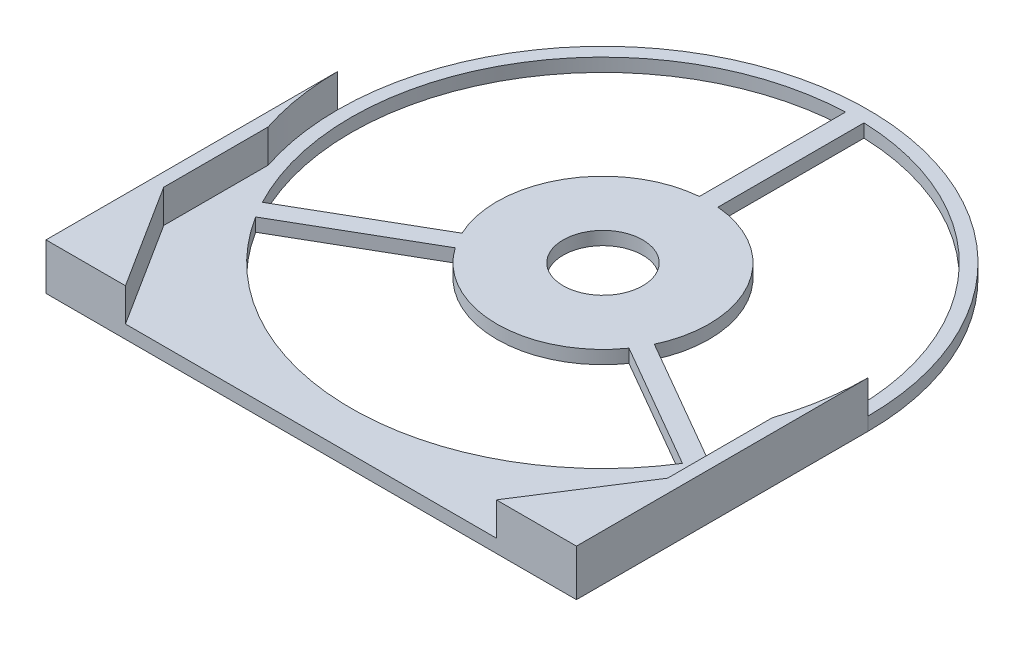
ISO-10303-21;
HEADER;
FILE_DESCRIPTION(('STEP AP214'),'2;1');
FILE_NAME('part.step','',(''),(''),'','','');
FILE_SCHEMA(('AUTOMOTIVE_DESIGN { 1 0 10303 214 1 1 1 1 }'));
ENDSEC;
DATA;
#1=APPLICATION_CONTEXT('core data for automotive mechanical design processes');
#2=APPLICATION_PROTOCOL_DEFINITION('international standard','automotive_design',2000,#1);
#3=PRODUCT_CONTEXT('',#1,'mechanical');
#4=PRODUCT('Part','Part','',(#3));
#5=PRODUCT_RELATED_PRODUCT_CATEGORY('part','',(#4));
#6=PRODUCT_DEFINITION_FORMATION('','',#4);
#7=PRODUCT_DEFINITION_CONTEXT('part definition',#1,'design');
#8=PRODUCT_DEFINITION('design','',#6,#7);
#9=PRODUCT_DEFINITION_SHAPE('','',#8);
#10=(LENGTH_UNIT() NAMED_UNIT(*) SI_UNIT(.MILLI.,.METRE.));
#11=(NAMED_UNIT(*) PLANE_ANGLE_UNIT() SI_UNIT($,.RADIAN.));
#12=(NAMED_UNIT(*) SI_UNIT($,.STERADIAN.) SOLID_ANGLE_UNIT());
#13=UNCERTAINTY_MEASURE_WITH_UNIT(LENGTH_MEASURE(1.E-05),#10,'distance_accuracy_value','');
#14=(GEOMETRIC_REPRESENTATION_CONTEXT(3) GLOBAL_UNCERTAINTY_ASSIGNED_CONTEXT((#13)) GLOBAL_UNIT_ASSIGNED_CONTEXT((#10,
#11,#12)) REPRESENTATION_CONTEXT('',''));
#15=CARTESIAN_POINT('',(0.,0.,0.));
#16=DIRECTION('',(0.,0.,1.));
#17=DIRECTION('',(1.,0.,0.));
#18=AXIS2_PLACEMENT_3D('',#15,#16,#17);
#19=CARTESIAN_POINT('',(0.,1.,0.));
#20=DIRECTION('',(0.,1.,0.));
#21=DIRECTION('',(0.,0.,1.));
#22=AXIS2_PLACEMENT_3D('',#19,#20,#21);
#23=PLANE('',#22);
#24=DIRECTION('',(-0.866025403784443,0.,0.499999999999992));
#25=VECTOR('',#24,1.);
#26=CARTESIAN_POINT('',(-0.349999999999994,1.,-0.60621778264911));
#27=LINE('',#26,#25);
#28=CARTESIAN_POINT('',(-7.25163024219643,1.,3.37844029553018));
#29=VERTEX_POINT('',#28);
#30=CARTESIAN_POINT('',(-16.7933117102366,1.,8.88733265962469));
#31=VERTEX_POINT('',#30);
#32=EDGE_CURVE('E373',#29,#31,#27,.T.);
#33=ORIENTED_EDGE('',*,*,#32,.T.);
#34=CARTESIAN_POINT('',(0.,1.,0.));
#35=DIRECTION('',(0.,1.,0.));
#36=DIRECTION('',(0.,0.,1.));
#37=AXIS2_PLACEMENT_3D('',#34,#35,#36);
#38=CIRCLE('',#37,19.);
#39=CARTESIAN_POINT('',(-0.700000000000007,1.,-18.9871008845479));
#40=VERTEX_POINT('',#39);
#41=EDGE_CURVE('E371',#40,#31,#38,.T.);
#42=ORIENTED_EDGE('',*,*,#41,.F.);
#43=DIRECTION('',(0.,0.,-1.));
#44=VECTOR('',#43,1.);
#45=CARTESIAN_POINT('',(-0.7,1.,0.));
#46=LINE('',#45,#44);
#47=CARTESIAN_POINT('',(-0.700000000000003,1.,-7.96931615635871));
#48=VERTEX_POINT('',#47);
#49=EDGE_CURVE('E349',#48,#40,#46,.T.);
#50=ORIENTED_EDGE('',*,*,#49,.F.);
#51=CARTESIAN_POINT('',(0.,1.,0.));
#52=DIRECTION('',(0.,1.,0.));
#53=DIRECTION('',(0.,0.,1.));
#54=AXIS2_PLACEMENT_3D('',#51,#52,#53);
#55=CIRCLE('',#54,8.);
#56=EDGE_CURVE('E361',#48,#29,#55,.T.);
#57=ORIENTED_EDGE('',*,*,#56,.T.);
#58=EDGE_LOOP('',(#33,#42,#50,#57));
#59=FACE_BOUND('',#58,.T.);
#60=DIRECTION('',(0.,0.,-1.));
#61=VECTOR('',#60,1.);
#62=CARTESIAN_POINT('',(0.7,1.,0.));
#63=LINE('',#62,#61);
#64=CARTESIAN_POINT('',(0.7,1.,-7.96931615635871));
#65=VERTEX_POINT('',#64);
#66=CARTESIAN_POINT('',(0.7,1.,-18.9871008845479));
#67=VERTEX_POINT('',#66);
#68=EDGE_CURVE('E342',#65,#67,#63,.T.);
#69=ORIENTED_EDGE('',*,*,#68,.T.);
#70=CARTESIAN_POINT('',(0.,1.,0.));
#71=DIRECTION('',(0.,1.,0.));
#72=DIRECTION('',(0.,0.,1.));
#73=AXIS2_PLACEMENT_3D('',#70,#71,#72);
#74=CIRCLE('',#73,19.);
#75=CARTESIAN_POINT('',(16.7933117102364,1.,8.88733265962492));
#76=VERTEX_POINT('',#75);
#77=EDGE_CURVE('E340',#76,#67,#74,.T.);
#78=ORIENTED_EDGE('',*,*,#77,.F.);
#79=DIRECTION('',(0.866025403784437,0.,0.500000000000004));
#80=VECTOR('',#79,1.);
#81=CARTESIAN_POINT('',(0.350000000000003,1.,-0.606217782649106));
#82=LINE('',#81,#80);
#83=CARTESIAN_POINT('',(7.25163024219639,1.,3.37844029553028));
#84=VERTEX_POINT('',#83);
#85=EDGE_CURVE('E319',#84,#76,#82,.T.);
#86=ORIENTED_EDGE('',*,*,#85,.F.);
#87=CARTESIAN_POINT('',(0.,1.,0.));
#88=DIRECTION('',(0.,1.,0.));
#89=DIRECTION('',(0.,0.,1.));
#90=AXIS2_PLACEMENT_3D('',#87,#88,#89);
#91=CIRCLE('',#90,8.);
#92=EDGE_CURVE('E330',#84,#65,#91,.T.);
#93=ORIENTED_EDGE('',*,*,#92,.T.);
#94=EDGE_LOOP('',(#69,#78,#86,#93));
#95=FACE_BOUND('',#94,.T.);
#96=CARTESIAN_POINT('',(0.,1.,0.));
#97=DIRECTION('',(0.,1.,0.));
#98=DIRECTION('',(0.,0.,1.));
#99=AXIS2_PLACEMENT_3D('',#96,#97,#98);
#100=CIRCLE('',#99,3.);
#101=CARTESIAN_POINT('',(0.,1.,3.));
#102=VERTEX_POINT('',#101);
#103=EDGE_CURVE('E288',#102,#102,#100,.T.);
#104=ORIENTED_EDGE('',*,*,#103,.F.);
#105=EDGE_LOOP('',(#104));
#106=FACE_BOUND('',#105,.T.);
#107=DIRECTION('',(-0.866025403784443,0.,0.499999999999992));
#108=VECTOR('',#107,1.);
#109=CARTESIAN_POINT('',(0.349999999999995,1.,0.60621778264911));
#110=LINE('',#109,#108);
#111=CARTESIAN_POINT('',(-6.55163024219645,1.,4.59087586082841));
#112=VERTEX_POINT('',#111);
#113=CARTESIAN_POINT('',(-16.0933117102366,1.,10.0997682249229));
#114=VERTEX_POINT('',#113);
#115=EDGE_CURVE('E292',#112,#114,#110,.T.);
#116=ORIENTED_EDGE('',*,*,#115,.F.);
#117=CARTESIAN_POINT('',(0.,1.,0.));
#118=DIRECTION('',(0.,1.,0.));
#119=DIRECTION('',(0.,0.,1.));
#120=AXIS2_PLACEMENT_3D('',#117,#118,#119);
#121=CIRCLE('',#120,8.);
#122=CARTESIAN_POINT('',(6.55163024219638,1.,4.59087586082849));
#123=VERTEX_POINT('',#122);
#124=EDGE_CURVE('E299',#112,#123,#121,.T.);
#125=ORIENTED_EDGE('',*,*,#124,.T.);
#126=DIRECTION('',(0.866025403784436,0.,0.500000000000004));
#127=VECTOR('',#126,1.);
#128=CARTESIAN_POINT('',(-0.350000000000003,1.,0.606217782649106));
#129=LINE('',#128,#127);
#130=CARTESIAN_POINT('',(16.0933117102364,1.,10.0997682249231));
#131=VERTEX_POINT('',#130);
#132=EDGE_CURVE('E312',#123,#131,#129,.T.);
#133=ORIENTED_EDGE('',*,*,#132,.T.);
#134=CARTESIAN_POINT('',(0.,1.,0.));
#135=DIRECTION('',(0.,1.,0.));
#136=DIRECTION('',(0.,0.,1.));
#137=AXIS2_PLACEMENT_3D('',#134,#135,#136);
#138=CIRCLE('',#137,19.);
#139=EDGE_CURVE('E309',#114,#131,#138,.T.);
#140=ORIENTED_EDGE('',*,*,#139,.F.);
#141=EDGE_LOOP('',(#116,#125,#133,#140));
#142=FACE_BOUND('',#141,.T.);
#143=DIRECTION('',(0.,0.,1.));
#144=VECTOR('',#143,1.);
#145=CARTESIAN_POINT('',(-19.,1.,-20.));
#146=LINE('',#145,#144);
#147=CARTESIAN_POINT('',(-19.,1.,6.24499799839841));
#148=VERTEX_POINT('',#147);
#149=CARTESIAN_POINT('',(-19.,1.,14.1224989991992));
#150=VERTEX_POINT('',#149);
#151=EDGE_CURVE('E279',#148,#150,#146,.T.);
#152=ORIENTED_EDGE('',*,*,#151,.T.);
#153=DIRECTION('',(-0.53529760919979,0.,-0.844663524478824));
#154=VECTOR('',#153,1.);
#155=CARTESIAN_POINT('',(-19.,1.,14.1224989991992));
#156=LINE('',#155,#154);
#157=CARTESIAN_POINT('',(-14.0077074124877,1.,22.));
#158=VERTEX_POINT('',#157);
#159=EDGE_CURVE('E101',#158,#150,#156,.T.);
#160=ORIENTED_EDGE('',*,*,#159,.F.);
#161=DIRECTION('',(1.,0.,0.));
#162=VECTOR('',#161,1.);
#163=CARTESIAN_POINT('',(-19.,1.,22.));
#164=LINE('',#163,#162);
#165=CARTESIAN_POINT('',(13.9609349112244,1.,22.));
#166=VERTEX_POINT('',#165);
#167=EDGE_CURVE('E259',#158,#166,#164,.T.);
#168=ORIENTED_EDGE('',*,*,#167,.T.);
#169=DIRECTION('',(-0.538861327297642,0.,0.842394485940538));
#170=VECTOR('',#169,1.);
#171=CARTESIAN_POINT('',(19.,1.,14.1224989991992));
#172=LINE('',#171,#170);
#173=CARTESIAN_POINT('',(19.,1.,14.1224989991992));
#174=VERTEX_POINT('',#173);
#175=EDGE_CURVE('E261',#174,#166,#172,.T.);
#176=ORIENTED_EDGE('',*,*,#175,.F.);
#177=DIRECTION('',(0.,0.,1.));
#178=VECTOR('',#177,1.);
#179=CARTESIAN_POINT('',(19.,1.,-20.));
#180=LINE('',#179,#178);
#181=CARTESIAN_POINT('',(19.,1.,6.24499799839841));
#182=VERTEX_POINT('',#181);
#183=EDGE_CURVE('E280',#182,#174,#180,.T.);
#184=ORIENTED_EDGE('',*,*,#183,.F.);
#185=CARTESIAN_POINT('',(0.,1.,0.));
#186=DIRECTION('',(0.,1.,0.));
#187=DIRECTION('',(0.,0.,1.));
#188=AXIS2_PLACEMENT_3D('',#185,#186,#187);
#189=CIRCLE('',#188,20.);
#190=CARTESIAN_POINT('',(20.,1.,0.));
#191=VERTEX_POINT('',#190);
#192=EDGE_CURVE('E380',#182,#191,#189,.T.);
#193=ORIENTED_EDGE('',*,*,#192,.T.);
#194=CARTESIAN_POINT('',(0.,1.,0.));
#195=DIRECTION('',(0.,1.,0.));
#196=DIRECTION('',(0.,0.,1.));
#197=AXIS2_PLACEMENT_3D('',#194,#195,#196);
#198=CIRCLE('',#197,20.);
#199=CARTESIAN_POINT('',(-20.,1.,0.));
#200=VERTEX_POINT('',#199);
#201=EDGE_CURVE('E405',#191,#200,#198,.T.);
#202=ORIENTED_EDGE('',*,*,#201,.T.);
#203=EDGE_CURVE('E396',#200,#148,#189,.T.);
#204=ORIENTED_EDGE('',*,*,#203,.T.);
#205=EDGE_LOOP('',(#152,#160,#168,#176,#184,#193,#202,#204));
#206=FACE_BOUND('',#205,.T.);
#207=ADVANCED_FACE('F86',(#59,#95,#106,#142,#206),#23,.T.);
#208=CARTESIAN_POINT('',(-19.,3.5,-20.));
#209=DIRECTION('',(-1.,0.,0.));
#210=DIRECTION('',(0.,0.,1.));
#211=AXIS2_PLACEMENT_3D('',#208,#209,#210);
#212=PLANE('',#211);
#213=DIRECTION('',(0.,-1.,0.));
#214=VECTOR('',#213,1.);
#215=CARTESIAN_POINT('',(-19.,3.5,14.1224989991992));
#216=LINE('',#215,#214);
#217=CARTESIAN_POINT('',(-19.,3.5,14.1224989991992));
#218=VERTEX_POINT('',#217);
#219=EDGE_CURVE('E108',#218,#150,#216,.T.);
#220=ORIENTED_EDGE('',*,*,#219,.T.);
#221=ORIENTED_EDGE('',*,*,#151,.F.);
#222=DIRECTION('',(0.,-1.,0.));
#223=VECTOR('',#222,1.);
#224=CARTESIAN_POINT('',(-19.,3.5,6.24499799839841));
#225=LINE('',#224,#223);
#226=CARTESIAN_POINT('',(-19.,3.5,6.24499799839841));
#227=VERTEX_POINT('',#226);
#228=EDGE_CURVE('E286',#148,#227,#225,.F.);
#229=ORIENTED_EDGE('',*,*,#228,.T.);
#230=DIRECTION('',(0.,0.,1.));
#231=VECTOR('',#230,1.);
#232=CARTESIAN_POINT('',(-19.,3.5,0.));
#233=LINE('',#232,#231);
#234=EDGE_CURVE('E12',#227,#218,#233,.T.);
#235=ORIENTED_EDGE('',*,*,#234,.T.);
#236=EDGE_LOOP('',(#220,#221,#229,#235));
#237=FACE_BOUND('',#236,.T.);
#238=ADVANCED_FACE('F454',(#237),#212,.F.);
#239=CARTESIAN_POINT('',(19.,3.5,-20.));
#240=DIRECTION('',(1.,0.,0.));
#241=DIRECTION('',(0.,0.,-1.));
#242=AXIS2_PLACEMENT_3D('',#239,#240,#241);
#243=PLANE('',#242);
#244=DIRECTION('',(0.,-1.,0.));
#245=VECTOR('',#244,1.);
#246=CARTESIAN_POINT('',(19.,3.5,14.1224989991992));
#247=LINE('',#246,#245);
#248=CARTESIAN_POINT('',(19.,3.5,14.1224989991992));
#249=VERTEX_POINT('',#248);
#250=EDGE_CURVE('E275',#249,#174,#247,.T.);
#251=ORIENTED_EDGE('',*,*,#250,.F.);
#252=DIRECTION('',(0.,0.,-1.));
#253=VECTOR('',#252,1.);
#254=CARTESIAN_POINT('',(19.,3.5,0.));
#255=LINE('',#254,#253);
#256=CARTESIAN_POINT('',(19.,3.5,6.24499799839841));
#257=VERTEX_POINT('',#256);
#258=EDGE_CURVE('E94',#249,#257,#255,.T.);
#259=ORIENTED_EDGE('',*,*,#258,.T.);
#260=DIRECTION('',(0.,-1.,0.));
#261=VECTOR('',#260,1.);
#262=CARTESIAN_POINT('',(19.,3.5,6.24499799839841));
#263=LINE('',#262,#261);
#264=EDGE_CURVE('E283',#257,#182,#263,.T.);
#265=ORIENTED_EDGE('',*,*,#264,.T.);
#266=ORIENTED_EDGE('',*,*,#183,.T.);
#267=EDGE_LOOP('',(#251,#259,#265,#266));
#268=FACE_BOUND('',#267,.T.);
#269=ADVANCED_FACE('F427',(#268),#243,.F.);
#270=CARTESIAN_POINT('',(0.,3.5,0.));
#271=DIRECTION('',(0.,-1.,0.));
#272=DIRECTION('',(0.,0.,-1.));
#273=AXIS2_PLACEMENT_3D('',#270,#271,#272);
#274=CYLINDRICAL_SURFACE('',#273,20.);
#275=ORIENTED_EDGE('',*,*,#228,.F.);
#276=ORIENTED_EDGE('',*,*,#203,.F.);
#277=DIRECTION('',(0.,-1.,0.));
#278=VECTOR('',#277,1.);
#279=CARTESIAN_POINT('',(-20.,3.5,0.));
#280=LINE('',#279,#278);
#281=CARTESIAN_POINT('',(-20.,3.5,0.));
#282=VERTEX_POINT('',#281);
#283=EDGE_CURVE('E401',#282,#200,#280,.T.);
#284=ORIENTED_EDGE('',*,*,#283,.F.);
#285=CARTESIAN_POINT('',(0.,3.5,0.));
#286=DIRECTION('',(0.,1.,0.));
#287=DIRECTION('',(0.,0.,1.));
#288=AXIS2_PLACEMENT_3D('',#285,#286,#287);
#289=CIRCLE('',#288,20.);
#290=EDGE_CURVE('E388',#282,#227,#289,.T.);
#291=ORIENTED_EDGE('',*,*,#290,.T.);
#292=EDGE_LOOP('',(#275,#276,#284,#291));
#293=FACE_BOUND('',#292,.T.);
#294=ADVANCED_FACE('F453',(#293),#274,.F.);
#295=CARTESIAN_POINT('',(0.,3.5,0.));
#296=DIRECTION('',(0.,1.,0.));
#297=DIRECTION('',(0.,0.,1.));
#298=AXIS2_PLACEMENT_3D('',#295,#296,#297);
#299=PLANE('',#298);
#300=ORIENTED_EDGE('',*,*,#234,.F.);
#301=ORIENTED_EDGE('',*,*,#290,.F.);
#302=DIRECTION('',(0.,0.,1.));
#303=VECTOR('',#302,1.);
#304=CARTESIAN_POINT('',(-20.,3.5,0.));
#305=LINE('',#304,#303);
#306=CARTESIAN_POINT('',(-20.,3.5,22.));
#307=VERTEX_POINT('',#306);
#308=EDGE_CURVE('E249',#282,#307,#305,.T.);
#309=ORIENTED_EDGE('',*,*,#308,.T.);
#310=DIRECTION('',(1.,0.,0.));
#311=VECTOR('',#310,1.);
#312=CARTESIAN_POINT('',(0.,3.5,22.));
#313=LINE('',#312,#311);
#314=CARTESIAN_POINT('',(-14.0077074124877,3.5,22.));
#315=VERTEX_POINT('',#314);
#316=EDGE_CURVE('E241',#307,#315,#313,.T.);
#317=ORIENTED_EDGE('',*,*,#316,.T.);
#318=DIRECTION('',(-0.53529760919979,0.,-0.844663524478824));
#319=VECTOR('',#318,1.);
#320=CARTESIAN_POINT('',(-19.,3.5,14.1224989991992));
#321=LINE('',#320,#319);
#322=EDGE_CURVE('E246',#315,#218,#321,.T.);
#323=ORIENTED_EDGE('',*,*,#322,.T.);
#324=EDGE_LOOP('',(#300,#301,#309,#317,#323));
#325=FACE_BOUND('',#324,.T.);
#326=ADVANCED_FACE('F244',(#325),#299,.T.);
#327=CARTESIAN_POINT('',(20.,1.,0.));
#328=DIRECTION('',(1.,0.,0.));
#329=DIRECTION('',(0.,0.,-1.));
#330=AXIS2_PLACEMENT_3D('',#327,#328,#329);
#331=PLANE('',#330);
#332=DIRECTION('',(0.,0.,1.));
#333=VECTOR('',#332,1.);
#334=CARTESIAN_POINT('',(20.,0.,0.));
#335=LINE('',#334,#333);
#336=CARTESIAN_POINT('',(20.,0.,0.));
#337=VERTEX_POINT('',#336);
#338=CARTESIAN_POINT('',(20.,0.,22.));
#339=VERTEX_POINT('',#338);
#340=EDGE_CURVE('E404',#337,#339,#335,.T.);
#341=ORIENTED_EDGE('',*,*,#340,.F.);
#342=DIRECTION('',(0.,-1.,0.));
#343=VECTOR('',#342,1.);
#344=CARTESIAN_POINT('',(20.,1.,0.));
#345=LINE('',#344,#343);
#346=EDGE_CURVE('E423',#191,#337,#345,.T.);
#347=ORIENTED_EDGE('',*,*,#346,.F.);
#348=DIRECTION('',(0.,-1.,0.));
#349=VECTOR('',#348,1.);
#350=CARTESIAN_POINT('',(20.,3.5,0.));
#351=LINE('',#350,#349);
#352=CARTESIAN_POINT('',(20.,3.5,0.));
#353=VERTEX_POINT('',#352);
#354=EDGE_CURVE('E395',#353,#191,#351,.T.);
#355=ORIENTED_EDGE('',*,*,#354,.F.);
#356=DIRECTION('',(0.,0.,-1.));
#357=VECTOR('',#356,1.);
#358=CARTESIAN_POINT('',(20.,3.5,0.));
#359=LINE('',#358,#357);
#360=CARTESIAN_POINT('',(20.,3.5,22.));
#361=VERTEX_POINT('',#360);
#362=EDGE_CURVE('E252',#361,#353,#359,.T.);
#363=ORIENTED_EDGE('',*,*,#362,.F.);
#364=DIRECTION('',(0.,-1.,0.));
#365=VECTOR('',#364,1.);
#366=CARTESIAN_POINT('',(20.,1.,22.));
#367=LINE('',#366,#365);
#368=EDGE_CURVE('E407',#361,#339,#367,.T.);
#369=ORIENTED_EDGE('',*,*,#368,.T.);
#370=EDGE_LOOP('',(#341,#347,#355,#363,#369));
#371=FACE_BOUND('',#370,.T.);
#372=ADVANCED_FACE('F88',(#371),#331,.T.);
#373=CARTESIAN_POINT('',(0.,1.,0.));
#374=DIRECTION('',(0.,-1.,0.));
#375=DIRECTION('',(0.,0.,-1.));
#376=AXIS2_PLACEMENT_3D('',#373,#374,#375);
#377=CYLINDRICAL_SURFACE('',#376,20.);
#378=CARTESIAN_POINT('',(0.,0.,0.));
#379=DIRECTION('',(0.,1.,0.));
#380=DIRECTION('',(0.,0.,1.));
#381=AXIS2_PLACEMENT_3D('',#378,#379,#380);
#382=CIRCLE('',#381,20.);
#383=CARTESIAN_POINT('',(-20.,0.,0.));
#384=VERTEX_POINT('',#383);
#385=EDGE_CURVE('E411',#337,#384,#382,.T.);
#386=ORIENTED_EDGE('',*,*,#385,.T.);
#387=DIRECTION('',(0.,-1.,0.));
#388=VECTOR('',#387,1.);
#389=CARTESIAN_POINT('',(-20.,1.,0.));
#390=LINE('',#389,#388);
#391=EDGE_CURVE('E420',#200,#384,#390,.T.);
#392=ORIENTED_EDGE('',*,*,#391,.F.);
#393=ORIENTED_EDGE('',*,*,#201,.F.);
#394=ORIENTED_EDGE('',*,*,#346,.T.);
#395=EDGE_LOOP('',(#386,#392,#393,#394));
#396=FACE_BOUND('',#395,.T.);
#397=ADVANCED_FACE('F446',(#396),#377,.T.);
#398=CARTESIAN_POINT('',(-20.,1.,0.));
#399=DIRECTION('',(1.,0.,0.));
#400=DIRECTION('',(0.,0.,-1.));
#401=AXIS2_PLACEMENT_3D('',#398,#399,#400);
#402=PLANE('',#401);
#403=DIRECTION('',(0.,0.,1.));
#404=VECTOR('',#403,1.);
#405=CARTESIAN_POINT('',(-20.,0.,0.));
#406=LINE('',#405,#404);
#407=CARTESIAN_POINT('',(-20.,0.,22.));
#408=VERTEX_POINT('',#407);
#409=EDGE_CURVE('E413',#384,#408,#406,.T.);
#410=ORIENTED_EDGE('',*,*,#409,.T.);
#411=DIRECTION('',(0.,-1.,0.));
#412=VECTOR('',#411,1.);
#413=CARTESIAN_POINT('',(-20.,1.,22.));
#414=LINE('',#413,#412);
#415=EDGE_CURVE('E418',#307,#408,#414,.T.);
#416=ORIENTED_EDGE('',*,*,#415,.F.);
#417=ORIENTED_EDGE('',*,*,#308,.F.);
#418=ORIENTED_EDGE('',*,*,#283,.T.);
#419=ORIENTED_EDGE('',*,*,#391,.T.);
#420=EDGE_LOOP('',(#410,#416,#417,#418,#419));
#421=FACE_BOUND('',#420,.T.);
#422=ADVANCED_FACE('F449',(#421),#402,.F.);
#423=CARTESIAN_POINT('',(0.,1.,22.));
#424=DIRECTION('',(0.,0.,-1.));
#425=DIRECTION('',(-1.,0.,0.));
#426=AXIS2_PLACEMENT_3D('',#423,#424,#425);
#427=PLANE('',#426);
#428=ORIENTED_EDGE('',*,*,#167,.F.);
#429=DIRECTION('',(0.,-1.,0.));
#430=VECTOR('',#429,1.);
#431=CARTESIAN_POINT('',(-14.0077074124877,3.5,22.));
#432=LINE('',#431,#430);
#433=EDGE_CURVE('E256',#315,#158,#432,.T.);
#434=ORIENTED_EDGE('',*,*,#433,.F.);
#435=ORIENTED_EDGE('',*,*,#316,.F.);
#436=ORIENTED_EDGE('',*,*,#415,.T.);
#437=DIRECTION('',(1.,0.,0.));
#438=VECTOR('',#437,1.);
#439=CARTESIAN_POINT('',(0.,0.,22.));
#440=LINE('',#439,#438);
#441=EDGE_CURVE('E408',#408,#339,#440,.T.);
#442=ORIENTED_EDGE('',*,*,#441,.T.);
#443=ORIENTED_EDGE('',*,*,#368,.F.);
#444=CARTESIAN_POINT('',(13.9609349112244,3.5,22.));
#445=VERTEX_POINT('',#444);
#446=EDGE_CURVE('E253',#445,#361,#313,.T.);
#447=ORIENTED_EDGE('',*,*,#446,.F.);
#448=DIRECTION('',(0.,-1.,0.));
#449=VECTOR('',#448,1.);
#450=CARTESIAN_POINT('',(13.9609349112244,3.5,22.));
#451=LINE('',#450,#449);
#452=EDGE_CURVE('E271',#445,#166,#451,.T.);
#453=ORIENTED_EDGE('',*,*,#452,.T.);
#454=EDGE_LOOP('',(#428,#434,#435,#436,#442,#443,#447,#453));
#455=FACE_BOUND('',#454,.T.);
#456=ADVANCED_FACE('F257',(#455),#427,.F.);
#457=CARTESIAN_POINT('',(0.,0.,0.));
#458=DIRECTION('',(0.,1.,0.));
#459=DIRECTION('',(0.,0.,1.));
#460=AXIS2_PLACEMENT_3D('',#457,#458,#459);
#461=PLANE('',#460);
#462=CARTESIAN_POINT('',(0.,0.,0.));
#463=DIRECTION('',(0.,1.,0.));
#464=DIRECTION('',(0.,0.,1.));
#465=AXIS2_PLACEMENT_3D('',#462,#463,#464);
#466=CIRCLE('',#465,3.);
#467=CARTESIAN_POINT('',(0.,0.,3.));
#468=VERTEX_POINT('',#467);
#469=EDGE_CURVE('E289',#468,#468,#466,.T.);
#470=ORIENTED_EDGE('',*,*,#469,.T.);
#471=EDGE_LOOP('',(#470));
#472=FACE_BOUND('',#471,.T.);
#473=CARTESIAN_POINT('',(0.,0.,0.));
#474=DIRECTION('',(0.,1.,0.));
#475=DIRECTION('',(0.,0.,1.));
#476=AXIS2_PLACEMENT_3D('',#473,#474,#475);
#477=CIRCLE('',#476,8.);
#478=CARTESIAN_POINT('',(-6.55163024219645,0.,4.59087586082841));
#479=VERTEX_POINT('',#478);
#480=CARTESIAN_POINT('',(6.55163024219638,0.,4.59087586082849));
#481=VERTEX_POINT('',#480);
#482=EDGE_CURVE('E305',#479,#481,#477,.T.);
#483=ORIENTED_EDGE('',*,*,#482,.F.);
#484=DIRECTION('',(-0.866025403784443,0.,0.499999999999992));
#485=VECTOR('',#484,1.);
#486=CARTESIAN_POINT('',(0.349999999999995,0.,0.60621778264911));
#487=LINE('',#486,#485);
#488=CARTESIAN_POINT('',(-16.0933117102366,0.,10.0997682249229));
#489=VERTEX_POINT('',#488);
#490=EDGE_CURVE('E295',#479,#489,#487,.T.);
#491=ORIENTED_EDGE('',*,*,#490,.T.);
#492=CARTESIAN_POINT('',(0.,0.,0.));
#493=DIRECTION('',(0.,1.,0.));
#494=DIRECTION('',(0.,0.,1.));
#495=AXIS2_PLACEMENT_3D('',#492,#493,#494);
#496=CIRCLE('',#495,19.);
#497=CARTESIAN_POINT('',(16.0933117102364,0.,10.0997682249231));
#498=VERTEX_POINT('',#497);
#499=EDGE_CURVE('E298',#489,#498,#496,.T.);
#500=ORIENTED_EDGE('',*,*,#499,.T.);
#501=DIRECTION('',(0.866025403784436,0.,0.500000000000004));
#502=VECTOR('',#501,1.);
#503=CARTESIAN_POINT('',(-0.350000000000003,0.,0.606217782649106));
#504=LINE('',#503,#502);
#505=EDGE_CURVE('E302',#481,#498,#504,.T.);
#506=ORIENTED_EDGE('',*,*,#505,.F.);
#507=EDGE_LOOP('',(#483,#491,#500,#506));
#508=FACE_BOUND('',#507,.T.);
#509=CARTESIAN_POINT('',(0.,0.,0.));
#510=DIRECTION('',(0.,1.,0.));
#511=DIRECTION('',(0.,0.,1.));
#512=AXIS2_PLACEMENT_3D('',#509,#510,#511);
#513=CIRCLE('',#512,8.);
#514=CARTESIAN_POINT('',(7.25163024219639,0.,3.37844029553028));
#515=VERTEX_POINT('',#514);
#516=CARTESIAN_POINT('',(0.7,0.,-7.96931615635871));
#517=VERTEX_POINT('',#516);
#518=EDGE_CURVE('E336',#515,#517,#513,.T.);
#519=ORIENTED_EDGE('',*,*,#518,.F.);
#520=DIRECTION('',(0.866025403784437,0.,0.500000000000004));
#521=VECTOR('',#520,1.);
#522=CARTESIAN_POINT('',(0.350000000000003,0.,-0.606217782649106));
#523=LINE('',#522,#521);
#524=CARTESIAN_POINT('',(16.7933117102364,0.,8.88733265962492));
#525=VERTEX_POINT('',#524);
#526=EDGE_CURVE('E326',#515,#525,#523,.T.);
#527=ORIENTED_EDGE('',*,*,#526,.T.);
#528=CARTESIAN_POINT('',(0.,0.,0.));
#529=DIRECTION('',(0.,1.,0.));
#530=DIRECTION('',(0.,0.,1.));
#531=AXIS2_PLACEMENT_3D('',#528,#529,#530);
#532=CIRCLE('',#531,19.);
#533=CARTESIAN_POINT('',(0.7,0.,-18.9871008845479));
#534=VERTEX_POINT('',#533);
#535=EDGE_CURVE('E329',#525,#534,#532,.T.);
#536=ORIENTED_EDGE('',*,*,#535,.T.);
#537=DIRECTION('',(0.,0.,-1.));
#538=VECTOR('',#537,1.);
#539=CARTESIAN_POINT('',(0.7,0.,0.));
#540=LINE('',#539,#538);
#541=EDGE_CURVE('E333',#517,#534,#540,.T.);
#542=ORIENTED_EDGE('',*,*,#541,.F.);
#543=EDGE_LOOP('',(#519,#527,#536,#542));
#544=FACE_BOUND('',#543,.T.);
#545=CARTESIAN_POINT('',(0.,0.,0.));
#546=DIRECTION('',(0.,1.,0.));
#547=DIRECTION('',(0.,0.,1.));
#548=AXIS2_PLACEMENT_3D('',#545,#546,#547);
#549=CIRCLE('',#548,8.);
#550=CARTESIAN_POINT('',(-0.700000000000003,0.,-7.96931615635871));
#551=VERTEX_POINT('',#550);
#552=CARTESIAN_POINT('',(-7.25163024219643,0.,3.37844029553018));
#553=VERTEX_POINT('',#552);
#554=EDGE_CURVE('E367',#551,#553,#549,.T.);
#555=ORIENTED_EDGE('',*,*,#554,.F.);
#556=DIRECTION('',(0.,0.,-1.));
#557=VECTOR('',#556,1.);
#558=CARTESIAN_POINT('',(-0.7,0.,0.));
#559=LINE('',#558,#557);
#560=CARTESIAN_POINT('',(-0.700000000000007,0.,-18.9871008845479));
#561=VERTEX_POINT('',#560);
#562=EDGE_CURVE('E357',#551,#561,#559,.T.);
#563=ORIENTED_EDGE('',*,*,#562,.T.);
#564=CARTESIAN_POINT('',(0.,0.,0.));
#565=DIRECTION('',(0.,1.,0.));
#566=DIRECTION('',(0.,0.,1.));
#567=AXIS2_PLACEMENT_3D('',#564,#565,#566);
#568=CIRCLE('',#567,19.);
#569=CARTESIAN_POINT('',(-16.7933117102366,0.,8.88733265962469));
#570=VERTEX_POINT('',#569);
#571=EDGE_CURVE('E360',#561,#570,#568,.T.);
#572=ORIENTED_EDGE('',*,*,#571,.T.);
#573=DIRECTION('',(-0.866025403784443,0.,0.499999999999992));
#574=VECTOR('',#573,1.);
#575=CARTESIAN_POINT('',(-0.349999999999994,0.,-0.60621778264911));
#576=LINE('',#575,#574);
#577=EDGE_CURVE('E364',#553,#570,#576,.T.);
#578=ORIENTED_EDGE('',*,*,#577,.F.);
#579=EDGE_LOOP('',(#555,#563,#572,#578));
#580=FACE_BOUND('',#579,.T.);
#581=ORIENTED_EDGE('',*,*,#340,.T.);
#582=ORIENTED_EDGE('',*,*,#441,.F.);
#583=ORIENTED_EDGE('',*,*,#409,.F.);
#584=ORIENTED_EDGE('',*,*,#385,.F.);
#585=EDGE_LOOP('',(#581,#582,#583,#584));
#586=FACE_BOUND('',#585,.T.);
#587=ADVANCED_FACE('F522',(#472,#508,#544,#580,#586),#461,.F.);
#588=ORIENTED_EDGE('',*,*,#264,.F.);
#589=EDGE_CURVE('E391',#257,#353,#289,.T.);
#590=ORIENTED_EDGE('',*,*,#589,.T.);
#591=ORIENTED_EDGE('',*,*,#354,.T.);
#592=ORIENTED_EDGE('',*,*,#192,.F.);
#593=EDGE_LOOP('',(#588,#590,#591,#592));
#594=FACE_BOUND('',#593,.T.);
#595=ADVANCED_FACE('F434',(#594),#274,.F.);
#596=ORIENTED_EDGE('',*,*,#258,.F.);
#597=DIRECTION('',(-0.538861327297642,0.,0.842394485940538));
#598=VECTOR('',#597,1.);
#599=CARTESIAN_POINT('',(19.,3.5,14.1224989991992));
#600=LINE('',#599,#598);
#601=EDGE_CURVE('E268',#249,#445,#600,.T.);
#602=ORIENTED_EDGE('',*,*,#601,.T.);
#603=ORIENTED_EDGE('',*,*,#446,.T.);
#604=ORIENTED_EDGE('',*,*,#362,.T.);
#605=ORIENTED_EDGE('',*,*,#589,.F.);
#606=EDGE_LOOP('',(#596,#602,#603,#604,#605));
#607=FACE_BOUND('',#606,.T.);
#608=ADVANCED_FACE('F435',(#607),#299,.T.);
#609=CARTESIAN_POINT('',(-0.7,0.,0.));
#610=DIRECTION('',(1.,0.,0.));
#611=DIRECTION('',(0.,0.,-1.));
#612=AXIS2_PLACEMENT_3D('',#609,#610,#611);
#613=PLANE('',#612);
#614=ORIENTED_EDGE('',*,*,#49,.T.);
#615=DIRECTION('',(0.,1.,0.));
#616=VECTOR('',#615,1.);
#617=CARTESIAN_POINT('',(-0.700000000000007,0.,-18.9871008845479));
#618=LINE('',#617,#616);
#619=EDGE_CURVE('E369',#561,#40,#618,.T.);
#620=ORIENTED_EDGE('',*,*,#619,.F.);
#621=ORIENTED_EDGE('',*,*,#562,.F.);
#622=DIRECTION('',(0.,1.,0.));
#623=VECTOR('',#622,1.);
#624=CARTESIAN_POINT('',(-0.700000000000003,0.,-7.96931615635871));
#625=LINE('',#624,#623);
#626=EDGE_CURVE('E378',#551,#48,#625,.T.);
#627=ORIENTED_EDGE('',*,*,#626,.T.);
#628=EDGE_LOOP('',(#614,#620,#621,#627));
#629=FACE_BOUND('',#628,.T.);
#630=ADVANCED_FACE('F508',(#629),#613,.F.);
#631=CARTESIAN_POINT('',(0.,0.,0.));
#632=DIRECTION('',(0.,1.,0.));
#633=DIRECTION('',(0.,0.,1.));
#634=AXIS2_PLACEMENT_3D('',#631,#632,#633);
#635=CYLINDRICAL_SURFACE('',#634,8.);
#636=ORIENTED_EDGE('',*,*,#56,.F.);
#637=ORIENTED_EDGE('',*,*,#626,.F.);
#638=ORIENTED_EDGE('',*,*,#554,.T.);
#639=DIRECTION('',(0.,1.,0.));
#640=VECTOR('',#639,1.);
#641=CARTESIAN_POINT('',(-7.25163024219643,0.,3.37844029553018));
#642=LINE('',#641,#640);
#643=EDGE_CURVE('E381',#553,#29,#642,.T.);
#644=ORIENTED_EDGE('',*,*,#643,.T.);
#645=EDGE_LOOP('',(#636,#637,#638,#644));
#646=FACE_BOUND('',#645,.T.);
#647=ADVANCED_FACE('F504',(#646),#635,.T.);
#648=CARTESIAN_POINT('',(-0.349999999999994,0.,-0.60621778264911));
#649=DIRECTION('',(-0.499999999999992,0.,-0.866025403784443));
#650=DIRECTION('',(-0.866025403784443,0.,0.499999999999992));
#651=AXIS2_PLACEMENT_3D('',#648,#649,#650);
#652=PLANE('',#651);
#653=ORIENTED_EDGE('',*,*,#32,.F.);
#654=ORIENTED_EDGE('',*,*,#643,.F.);
#655=ORIENTED_EDGE('',*,*,#577,.T.);
#656=DIRECTION('',(0.,1.,0.));
#657=VECTOR('',#656,1.);
#658=CARTESIAN_POINT('',(-16.7933117102366,0.,8.88733265962469));
#659=LINE('',#658,#657);
#660=EDGE_CURVE('E383',#570,#31,#659,.T.);
#661=ORIENTED_EDGE('',*,*,#660,.T.);
#662=EDGE_LOOP('',(#653,#654,#655,#661));
#663=FACE_BOUND('',#662,.T.);
#664=ADVANCED_FACE('F507',(#663),#652,.T.);
#665=CARTESIAN_POINT('',(0.,0.,0.));
#666=DIRECTION('',(0.,1.,0.));
#667=DIRECTION('',(0.,0.,1.));
#668=AXIS2_PLACEMENT_3D('',#665,#666,#667);
#669=CYLINDRICAL_SURFACE('',#668,19.);
#670=ORIENTED_EDGE('',*,*,#41,.T.);
#671=ORIENTED_EDGE('',*,*,#660,.F.);
#672=ORIENTED_EDGE('',*,*,#571,.F.);
#673=ORIENTED_EDGE('',*,*,#619,.T.);
#674=EDGE_LOOP('',(#670,#671,#672,#673));
#675=FACE_BOUND('',#674,.T.);
#676=ADVANCED_FACE('F502',(#675),#669,.F.);
#677=CARTESIAN_POINT('',(0.350000000000003,0.,-0.606217782649106));
#678=DIRECTION('',(-0.500000000000004,0.,0.866025403784436));
#679=DIRECTION('',(0.866025403784437,0.,0.500000000000004));
#680=AXIS2_PLACEMENT_3D('',#677,#678,#679);
#681=PLANE('',#680);
#682=ORIENTED_EDGE('',*,*,#85,.T.);
#683=DIRECTION('',(0.,1.,0.));
#684=VECTOR('',#683,1.);
#685=CARTESIAN_POINT('',(16.7933117102364,0.,8.88733265962492));
#686=LINE('',#685,#684);
#687=EDGE_CURVE('E338',#525,#76,#686,.T.);
#688=ORIENTED_EDGE('',*,*,#687,.F.);
#689=ORIENTED_EDGE('',*,*,#526,.F.);
#690=DIRECTION('',(0.,1.,0.));
#691=VECTOR('',#690,1.);
#692=CARTESIAN_POINT('',(7.25163024219639,0.,3.37844029553028));
#693=LINE('',#692,#691);
#694=EDGE_CURVE('E347',#515,#84,#693,.T.);
#695=ORIENTED_EDGE('',*,*,#694,.T.);
#696=EDGE_LOOP('',(#682,#688,#689,#695));
#697=FACE_BOUND('',#696,.T.);
#698=ADVANCED_FACE('F492',(#697),#681,.F.);
#699=CARTESIAN_POINT('',(0.,0.,0.));
#700=DIRECTION('',(0.,1.,0.));
#701=DIRECTION('',(0.,0.,1.));
#702=AXIS2_PLACEMENT_3D('',#699,#700,#701);
#703=CYLINDRICAL_SURFACE('',#702,8.);
#704=ORIENTED_EDGE('',*,*,#92,.F.);
#705=ORIENTED_EDGE('',*,*,#694,.F.);
#706=ORIENTED_EDGE('',*,*,#518,.T.);
#707=DIRECTION('',(0.,1.,0.));
#708=VECTOR('',#707,1.);
#709=CARTESIAN_POINT('',(0.7,0.,-7.96931615635871));
#710=LINE('',#709,#708);
#711=EDGE_CURVE('E350',#517,#65,#710,.T.);
#712=ORIENTED_EDGE('',*,*,#711,.T.);
#713=EDGE_LOOP('',(#704,#705,#706,#712));
#714=FACE_BOUND('',#713,.T.);
#715=ADVANCED_FACE('F488',(#714),#703,.T.);
#716=CARTESIAN_POINT('',(0.7,0.,0.));
#717=DIRECTION('',(1.,0.,0.));
#718=DIRECTION('',(0.,0.,-1.));
#719=AXIS2_PLACEMENT_3D('',#716,#717,#718);
#720=PLANE('',#719);
#721=ORIENTED_EDGE('',*,*,#68,.F.);
#722=ORIENTED_EDGE('',*,*,#711,.F.);
#723=ORIENTED_EDGE('',*,*,#541,.T.);
#724=DIRECTION('',(0.,1.,0.));
#725=VECTOR('',#724,1.);
#726=CARTESIAN_POINT('',(0.7,0.,-18.9871008845479));
#727=LINE('',#726,#725);
#728=EDGE_CURVE('E352',#534,#67,#727,.T.);
#729=ORIENTED_EDGE('',*,*,#728,.T.);
#730=EDGE_LOOP('',(#721,#722,#723,#729));
#731=FACE_BOUND('',#730,.T.);
#732=ADVANCED_FACE('F491',(#731),#720,.T.);
#733=CARTESIAN_POINT('',(0.,0.,0.));
#734=DIRECTION('',(0.,1.,0.));
#735=DIRECTION('',(0.,0.,1.));
#736=AXIS2_PLACEMENT_3D('',#733,#734,#735);
#737=CYLINDRICAL_SURFACE('',#736,19.);
#738=ORIENTED_EDGE('',*,*,#77,.T.);
#739=ORIENTED_EDGE('',*,*,#728,.F.);
#740=ORIENTED_EDGE('',*,*,#535,.F.);
#741=ORIENTED_EDGE('',*,*,#687,.T.);
#742=EDGE_LOOP('',(#738,#739,#740,#741));
#743=FACE_BOUND('',#742,.T.);
#744=ADVANCED_FACE('F486',(#743),#737,.F.);
#745=CARTESIAN_POINT('',(0.349999999999995,0.,0.60621778264911));
#746=DIRECTION('',(-0.499999999999992,0.,-0.866025403784443));
#747=DIRECTION('',(-0.866025403784443,0.,0.499999999999992));
#748=AXIS2_PLACEMENT_3D('',#745,#746,#747);
#749=PLANE('',#748);
#750=ORIENTED_EDGE('',*,*,#115,.T.);
#751=DIRECTION('',(0.,1.,0.));
#752=VECTOR('',#751,1.);
#753=CARTESIAN_POINT('',(-16.0933117102366,0.,10.0997682249229));
#754=LINE('',#753,#752);
#755=EDGE_CURVE('E307',#489,#114,#754,.T.);
#756=ORIENTED_EDGE('',*,*,#755,.F.);
#757=ORIENTED_EDGE('',*,*,#490,.F.);
#758=DIRECTION('',(0.,1.,0.));
#759=VECTOR('',#758,1.);
#760=CARTESIAN_POINT('',(-6.55163024219645,0.,4.59087586082841));
#761=LINE('',#760,#759);
#762=EDGE_CURVE('E317',#479,#112,#761,.T.);
#763=ORIENTED_EDGE('',*,*,#762,.T.);
#764=EDGE_LOOP('',(#750,#756,#757,#763));
#765=FACE_BOUND('',#764,.T.);
#766=ADVANCED_FACE('F476',(#765),#749,.F.);
#767=CARTESIAN_POINT('',(0.,0.,0.));
#768=DIRECTION('',(0.,1.,0.));
#769=DIRECTION('',(0.,0.,1.));
#770=AXIS2_PLACEMENT_3D('',#767,#768,#769);
#771=CYLINDRICAL_SURFACE('',#770,8.);
#772=ORIENTED_EDGE('',*,*,#124,.F.);
#773=ORIENTED_EDGE('',*,*,#762,.F.);
#774=ORIENTED_EDGE('',*,*,#482,.T.);
#775=DIRECTION('',(0.,1.,0.));
#776=VECTOR('',#775,1.);
#777=CARTESIAN_POINT('',(6.55163024219638,0.,4.59087586082849));
#778=LINE('',#777,#776);
#779=EDGE_CURVE('E320',#481,#123,#778,.T.);
#780=ORIENTED_EDGE('',*,*,#779,.T.);
#781=EDGE_LOOP('',(#772,#773,#774,#780));
#782=FACE_BOUND('',#781,.T.);
#783=ADVANCED_FACE('F472',(#782),#771,.T.);
#784=CARTESIAN_POINT('',(-0.350000000000003,0.,0.606217782649106));
#785=DIRECTION('',(-0.500000000000004,0.,0.866025403784436));
#786=DIRECTION('',(0.866025403784436,0.,0.500000000000004));
#787=AXIS2_PLACEMENT_3D('',#784,#785,#786);
#788=PLANE('',#787);
#789=ORIENTED_EDGE('',*,*,#132,.F.);
#790=ORIENTED_EDGE('',*,*,#779,.F.);
#791=ORIENTED_EDGE('',*,*,#505,.T.);
#792=DIRECTION('',(0.,1.,0.));
#793=VECTOR('',#792,1.);
#794=CARTESIAN_POINT('',(16.0933117102364,0.,10.0997682249231));
#795=LINE('',#794,#793);
#796=EDGE_CURVE('E322',#498,#131,#795,.T.);
#797=ORIENTED_EDGE('',*,*,#796,.T.);
#798=EDGE_LOOP('',(#789,#790,#791,#797));
#799=FACE_BOUND('',#798,.T.);
#800=ADVANCED_FACE('F475',(#799),#788,.T.);
#801=CARTESIAN_POINT('',(0.,0.,0.));
#802=DIRECTION('',(0.,1.,0.));
#803=DIRECTION('',(0.,0.,1.));
#804=AXIS2_PLACEMENT_3D('',#801,#802,#803);
#805=CYLINDRICAL_SURFACE('',#804,19.);
#806=ORIENTED_EDGE('',*,*,#139,.T.);
#807=ORIENTED_EDGE('',*,*,#796,.F.);
#808=ORIENTED_EDGE('',*,*,#499,.F.);
#809=ORIENTED_EDGE('',*,*,#755,.T.);
#810=EDGE_LOOP('',(#806,#807,#808,#809));
#811=FACE_BOUND('',#810,.T.);
#812=ADVANCED_FACE('F470',(#811),#805,.F.);
#813=CARTESIAN_POINT('',(0.,0.,0.));
#814=DIRECTION('',(0.,1.,0.));
#815=DIRECTION('',(0.,0.,1.));
#816=AXIS2_PLACEMENT_3D('',#813,#814,#815);
#817=CYLINDRICAL_SURFACE('',#816,3.);
#818=ORIENTED_EDGE('',*,*,#469,.F.);
#819=EDGE_LOOP('',(#818));
#820=FACE_BOUND('',#819,.T.);
#821=ORIENTED_EDGE('',*,*,#103,.T.);
#822=EDGE_LOOP('',(#821));
#823=FACE_BOUND('',#822,.T.);
#824=ADVANCED_FACE('F466',(#820,#823),#817,.F.);
#825=CARTESIAN_POINT('',(19.,3.5,14.1224989991992));
#826=DIRECTION('',(0.842394485940538,0.,0.538861327297642));
#827=DIRECTION('',(0.538861327297642,0.,-0.842394485940538));
#828=AXIS2_PLACEMENT_3D('',#825,#826,#827);
#829=PLANE('',#828);
#830=ORIENTED_EDGE('',*,*,#175,.T.);
#831=ORIENTED_EDGE('',*,*,#452,.F.);
#832=ORIENTED_EDGE('',*,*,#601,.F.);
#833=ORIENTED_EDGE('',*,*,#250,.T.);
#834=EDGE_LOOP('',(#830,#831,#832,#833));
#835=FACE_BOUND('',#834,.T.);
#836=ADVANCED_FACE('F469',(#835),#829,.F.);
#837=CARTESIAN_POINT('',(-19.,3.5,14.1224989991992));
#838=DIRECTION('',(-0.844663524478824,0.,0.53529760919979));
#839=DIRECTION('',(0.53529760919979,0.,0.844663524478824));
#840=AXIS2_PLACEMENT_3D('',#837,#838,#839);
#841=PLANE('',#840);
#842=ORIENTED_EDGE('',*,*,#159,.T.);
#843=ORIENTED_EDGE('',*,*,#219,.F.);
#844=ORIENTED_EDGE('',*,*,#322,.F.);
#845=ORIENTED_EDGE('',*,*,#433,.T.);
#846=EDGE_LOOP('',(#842,#843,#844,#845));
#847=FACE_BOUND('',#846,.T.);
#848=ADVANCED_FACE('F263',(#847),#841,.F.);
#849=CLOSED_SHELL('',(#207,#238,#269,#294,#326,#372,#397,#422,#456,#587,#595,#608,#630,#647,
#664,#676,#698,#715,#732,#744,#766,#783,#800,#812,#824,#836,#848));
#850=MANIFOLD_SOLID_BREP('B2',#849);
#851=ADVANCED_BREP_SHAPE_REPRESENTATION('',(#18,#850),#14);
#852=SHAPE_DEFINITION_REPRESENTATION(#9,#851);
ENDSEC;
END-ISO-10303-21;
